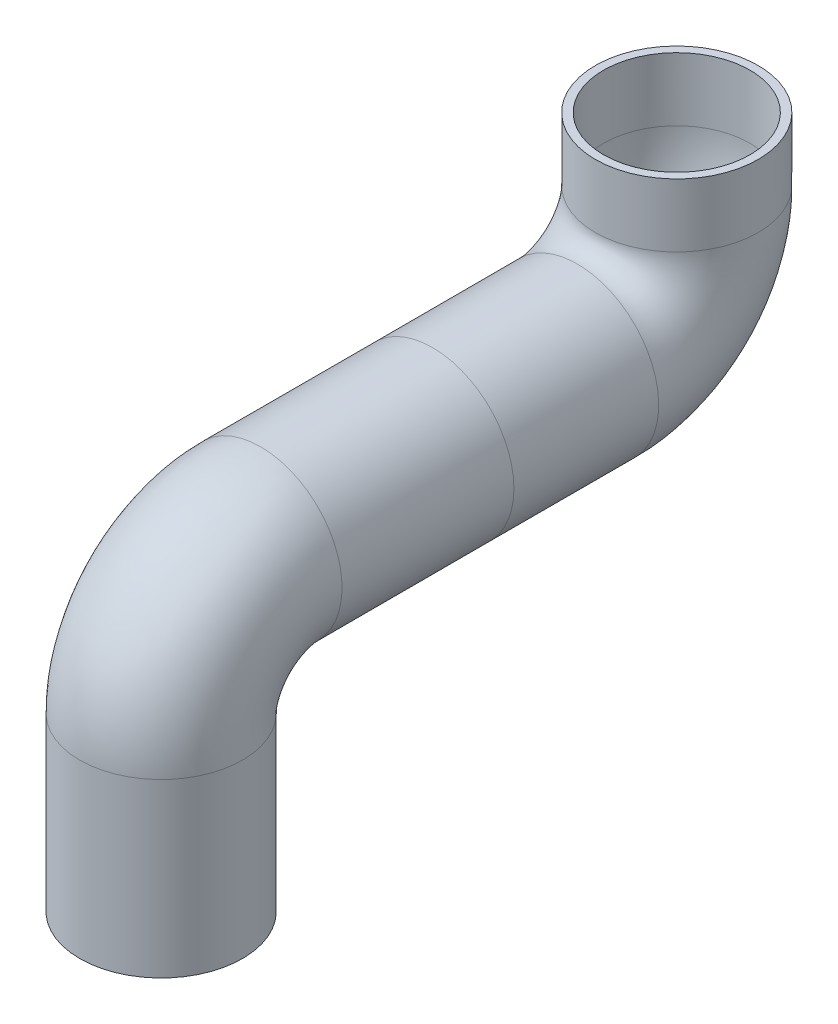
ISO-10303-21;
HEADER;
FILE_DESCRIPTION(('STEP AP214'),'2;1');
FILE_NAME('part.step','',(''),(''),'','','');
FILE_SCHEMA(('AUTOMOTIVE_DESIGN { 1 0 10303 214 1 1 1 1 }'));
ENDSEC;
DATA;
#1=APPLICATION_CONTEXT('core data for automotive mechanical design processes');
#2=APPLICATION_PROTOCOL_DEFINITION('international standard','automotive_design',2000,#1);
#3=PRODUCT_CONTEXT('',#1,'mechanical');
#4=PRODUCT('Part','Part','',(#3));
#5=PRODUCT_RELATED_PRODUCT_CATEGORY('part','',(#4));
#6=PRODUCT_DEFINITION_FORMATION('','',#4);
#7=PRODUCT_DEFINITION_CONTEXT('part definition',#1,'design');
#8=PRODUCT_DEFINITION('design','',#6,#7);
#9=PRODUCT_DEFINITION_SHAPE('','',#8);
#10=(LENGTH_UNIT() NAMED_UNIT(*) SI_UNIT(.MILLI.,.METRE.));
#11=(NAMED_UNIT(*) PLANE_ANGLE_UNIT() SI_UNIT($,.RADIAN.));
#12=(NAMED_UNIT(*) SI_UNIT($,.STERADIAN.) SOLID_ANGLE_UNIT());
#13=UNCERTAINTY_MEASURE_WITH_UNIT(LENGTH_MEASURE(1.E-05),#10,'distance_accuracy_value','');
#14=(GEOMETRIC_REPRESENTATION_CONTEXT(3) GLOBAL_UNCERTAINTY_ASSIGNED_CONTEXT((#13)) GLOBAL_UNIT_ASSIGNED_CONTEXT((#10,
#11,#12)) REPRESENTATION_CONTEXT('',''));
#15=CARTESIAN_POINT('',(0.,0.,0.));
#16=DIRECTION('',(0.,0.,1.));
#17=DIRECTION('',(1.,0.,0.));
#18=AXIS2_PLACEMENT_3D('',#15,#16,#17);
#19=CARTESIAN_POINT('',(0.,0.,0.));
#20=DIRECTION('',(0.,1.,0.));
#21=DIRECTION('',(0.,0.,1.));
#22=AXIS2_PLACEMENT_3D('',#19,#20,#21);
#23=CYLINDRICAL_SURFACE('',#22,150.);
#24=CARTESIAN_POINT('',(0.,316.669999999999,0.));
#25=DIRECTION('',(0.,1.,0.));
#26=DIRECTION('',(0.,0.,1.));
#27=AXIS2_PLACEMENT_3D('',#24,#25,#26);
#28=CIRCLE('',#27,150.);
#29=CARTESIAN_POINT('',(0.,316.669999999998,150.));
#30=VERTEX_POINT('',#29);
#31=EDGE_CURVE('E80',#30,#30,#28,.T.);
#32=ORIENTED_EDGE('',*,*,#31,.F.);
#33=EDGE_LOOP('',(#32));
#34=FACE_BOUND('',#33,.T.);
#35=CARTESIAN_POINT('',(0.,0.,0.));
#36=DIRECTION('',(0.,1.,0.));
#37=DIRECTION('',(0.,0.,1.));
#38=AXIS2_PLACEMENT_3D('',#35,#36,#37);
#39=CIRCLE('',#38,150.);
#40=CARTESIAN_POINT('',(0.,0.,150.));
#41=VERTEX_POINT('',#40);
#42=EDGE_CURVE('E47',#41,#41,#39,.T.);
#43=ORIENTED_EDGE('',*,*,#42,.T.);
#44=EDGE_LOOP('',(#43));
#45=FACE_BOUND('',#44,.T.);
#46=ADVANCED_FACE('F32',(#34,#45),#23,.T.);
#47=CARTESIAN_POINT('',(0.,316.67,-183.33));
#48=DIRECTION('',(-1.,0.,0.));
#49=DIRECTION('',(0.,0.,1.));
#50=AXIS2_PLACEMENT_3D('',#47,#48,#49);
#51=TOROIDAL_SURFACE('',#50,183.33,150.);
#52=CARTESIAN_POINT('',(0.,500.,-183.330000000001));
#53=DIRECTION('',(0.,0.,-1.));
#54=DIRECTION('',(0.,1.,0.));
#55=AXIS2_PLACEMENT_3D('',#52,#53,#54);
#56=CIRCLE('',#55,150.);
#57=CARTESIAN_POINT('',(0.,650.,-183.330000000002));
#58=VERTEX_POINT('',#57);
#59=EDGE_CURVE('E83',#58,#58,#56,.T.);
#60=CARTESIAN_POINT('',(0.,316.67,-183.33));
#61=DIRECTION('',(-1.,0.,0.));
#62=DIRECTION('',(0.,0.,1.));
#63=AXIS2_PLACEMENT_3D('',#60,#61,#62);
#64=CIRCLE('',#63,333.33);
#65=EDGE_CURVE('',#30,#58,#64,.T.);
#66=ORIENTED_EDGE('',*,*,#31,.T.);
#67=ORIENTED_EDGE('',*,*,#59,.F.);
#68=ORIENTED_EDGE('',*,*,#65,.T.);
#69=ORIENTED_EDGE('',*,*,#65,.F.);
#70=EDGE_LOOP('',(#66,#68,#67,#69));
#71=FACE_BOUND('',#70,.T.);
#72=ADVANCED_FACE('F110',(#71),#51,.T.);
#73=CARTESIAN_POINT('',(0.,500.,-183.330000000001));
#74=DIRECTION('',(0.,0.,-1.));
#75=DIRECTION('',(-1.,0.,0.));
#76=AXIS2_PLACEMENT_3D('',#73,#74,#75);
#77=CYLINDRICAL_SURFACE('',#76,150.);
#78=CARTESIAN_POINT('',(0.,500.,-500.));
#79=DIRECTION('',(0.,0.,-1.));
#80=DIRECTION('',(0.,1.,0.));
#81=AXIS2_PLACEMENT_3D('',#78,#79,#80);
#82=CIRCLE('',#81,150.);
#83=CARTESIAN_POINT('',(0.,650.,-500.));
#84=VERTEX_POINT('',#83);
#85=EDGE_CURVE('E86',#84,#84,#82,.T.);
#86=ORIENTED_EDGE('',*,*,#85,.F.);
#87=EDGE_LOOP('',(#86));
#88=FACE_BOUND('',#87,.T.);
#89=ORIENTED_EDGE('',*,*,#59,.T.);
#90=EDGE_LOOP('',(#89));
#91=FACE_BOUND('',#90,.T.);
#92=ADVANCED_FACE('F104',(#88,#91),#77,.T.);
#93=CARTESIAN_POINT('',(0.,500.,-500.));
#94=DIRECTION('',(0.,0.,-1.));
#95=DIRECTION('',(-1.,0.,0.));
#96=AXIS2_PLACEMENT_3D('',#93,#94,#95);
#97=CYLINDRICAL_SURFACE('',#96,150.);
#98=CARTESIAN_POINT('',(0.,500.,-766.669999999999));
#99=DIRECTION('',(0.,0.,-1.));
#100=DIRECTION('',(0.,1.,0.));
#101=AXIS2_PLACEMENT_3D('',#98,#99,#100);
#102=CIRCLE('',#101,150.);
#103=CARTESIAN_POINT('',(0.,350.,-766.669999999998));
#104=VERTEX_POINT('',#103);
#105=EDGE_CURVE('E88',#104,#104,#102,.T.);
#106=ORIENTED_EDGE('',*,*,#105,.F.);
#107=EDGE_LOOP('',(#106));
#108=FACE_BOUND('',#107,.T.);
#109=ORIENTED_EDGE('',*,*,#85,.T.);
#110=EDGE_LOOP('',(#109));
#111=FACE_BOUND('',#110,.T.);
#112=ADVANCED_FACE('F98',(#108,#111),#97,.T.);
#113=CARTESIAN_POINT('',(0.,683.33,-766.67));
#114=DIRECTION('',(1.,0.,0.));
#115=DIRECTION('',(0.,0.,-1.));
#116=AXIS2_PLACEMENT_3D('',#113,#114,#115);
#117=TOROIDAL_SURFACE('',#116,183.33,150.);
#118=CARTESIAN_POINT('',(0.,683.33,-950.));
#119=DIRECTION('',(0.,1.,0.));
#120=DIRECTION('',(0.,0.,1.));
#121=AXIS2_PLACEMENT_3D('',#118,#119,#120);
#122=CIRCLE('',#121,150.);
#123=CARTESIAN_POINT('',(0.,683.33,-1100.));
#124=VERTEX_POINT('',#123);
#125=EDGE_CURVE('E36',#124,#124,#122,.T.);
#126=CARTESIAN_POINT('',(0.,683.33,-766.67));
#127=DIRECTION('',(1.,0.,0.));
#128=DIRECTION('',(0.,0.,-1.));
#129=AXIS2_PLACEMENT_3D('',#126,#127,#128);
#130=CIRCLE('',#129,333.33);
#131=EDGE_CURVE('',#104,#124,#130,.T.);
#132=ORIENTED_EDGE('',*,*,#105,.T.);
#133=ORIENTED_EDGE('',*,*,#125,.F.);
#134=ORIENTED_EDGE('',*,*,#131,.T.);
#135=ORIENTED_EDGE('',*,*,#131,.F.);
#136=EDGE_LOOP('',(#132,#134,#133,#135));
#137=FACE_BOUND('',#136,.T.);
#138=ADVANCED_FACE('F96',(#137),#117,.T.);
#139=CARTESIAN_POINT('',(0.,683.33,-950.));
#140=DIRECTION('',(0.,1.,0.));
#141=DIRECTION('',(0.,0.,1.));
#142=AXIS2_PLACEMENT_3D('',#139,#140,#141);
#143=CYLINDRICAL_SURFACE('',#142,150.);
#144=CARTESIAN_POINT('',(0.,800.,-950.));
#145=DIRECTION('',(0.,1.,0.));
#146=DIRECTION('',(0.,0.,1.));
#147=AXIS2_PLACEMENT_3D('',#144,#145,#146);
#148=CIRCLE('',#147,150.);
#149=CARTESIAN_POINT('',(0.,800.,-800.));
#150=VERTEX_POINT('',#149);
#151=EDGE_CURVE('E52',#150,#150,#148,.T.);
#152=ORIENTED_EDGE('',*,*,#151,.F.);
#153=EDGE_LOOP('',(#152));
#154=FACE_BOUND('',#153,.T.);
#155=ORIENTED_EDGE('',*,*,#125,.T.);
#156=EDGE_LOOP('',(#155));
#157=FACE_BOUND('',#156,.T.);
#158=ADVANCED_FACE('F34',(#154,#157),#143,.T.);
#159=CARTESIAN_POINT('',(0.,0.,0.));
#160=DIRECTION('',(0.,1.,0.));
#161=DIRECTION('',(0.,0.,1.));
#162=AXIS2_PLACEMENT_3D('',#159,#160,#161);
#163=PLANE('',#162);
#164=CARTESIAN_POINT('',(0.,0.,0.));
#165=DIRECTION('',(0.,1.,0.));
#166=DIRECTION('',(0.,0.,1.));
#167=AXIS2_PLACEMENT_3D('',#164,#165,#166);
#168=CIRCLE('',#167,135.);
#169=CARTESIAN_POINT('',(0.,0.,135.));
#170=VERTEX_POINT('',#169);
#171=EDGE_CURVE('E78',#170,#170,#168,.F.);
#172=ORIENTED_EDGE('',*,*,#171,.F.);
#173=EDGE_LOOP('',(#172));
#174=FACE_BOUND('',#173,.T.);
#175=ORIENTED_EDGE('',*,*,#42,.F.);
#176=EDGE_LOOP('',(#175));
#177=FACE_BOUND('',#176,.T.);
#178=ADVANCED_FACE('F103',(#174,#177),#163,.F.);
#179=CARTESIAN_POINT('',(0.,800.,-950.));
#180=DIRECTION('',(0.,1.,0.));
#181=DIRECTION('',(0.,0.,1.));
#182=AXIS2_PLACEMENT_3D('',#179,#180,#181);
#183=PLANE('',#182);
#184=CARTESIAN_POINT('',(0.,800.,-950.));
#185=DIRECTION('',(0.,1.,0.));
#186=DIRECTION('',(0.,0.,1.));
#187=AXIS2_PLACEMENT_3D('',#184,#185,#186);
#188=CIRCLE('',#187,135.);
#189=CARTESIAN_POINT('',(0.,800.,-815.));
#190=VERTEX_POINT('',#189);
#191=EDGE_CURVE('E11',#190,#190,#188,.F.);
#192=ORIENTED_EDGE('',*,*,#191,.T.);
#193=EDGE_LOOP('',(#192));
#194=FACE_BOUND('',#193,.T.);
#195=ORIENTED_EDGE('',*,*,#151,.T.);
#196=EDGE_LOOP('',(#195));
#197=FACE_BOUND('',#196,.T.);
#198=ADVANCED_FACE('F59',(#194,#197),#183,.T.);
#199=CARTESIAN_POINT('',(0.,0.,0.));
#200=DIRECTION('',(0.,1.,0.));
#201=DIRECTION('',(0.,0.,1.));
#202=AXIS2_PLACEMENT_3D('',#199,#200,#201);
#203=CYLINDRICAL_SURFACE('',#202,135.);
#204=CARTESIAN_POINT('',(0.,316.669999999999,0.));
#205=DIRECTION('',(0.,1.,0.));
#206=DIRECTION('',(0.,0.,1.));
#207=AXIS2_PLACEMENT_3D('',#204,#205,#206);
#208=CIRCLE('',#207,135.);
#209=CARTESIAN_POINT('',(0.,316.669999999998,135.));
#210=VERTEX_POINT('',#209);
#211=EDGE_CURVE('E145',#210,#210,#208,.F.);
#212=ORIENTED_EDGE('',*,*,#211,.F.);
#213=EDGE_LOOP('',(#212));
#214=FACE_BOUND('',#213,.T.);
#215=ORIENTED_EDGE('',*,*,#171,.T.);
#216=EDGE_LOOP('',(#215));
#217=FACE_BOUND('',#216,.T.);
#218=ADVANCED_FACE('F122',(#214,#217),#203,.F.);
#219=CARTESIAN_POINT('',(0.,316.67,-183.33));
#220=DIRECTION('',(-1.,0.,0.));
#221=DIRECTION('',(0.,0.,1.));
#222=AXIS2_PLACEMENT_3D('',#219,#220,#221);
#223=TOROIDAL_SURFACE('',#222,183.33,135.);
#224=CARTESIAN_POINT('',(0.,500.,-183.330000000001));
#225=DIRECTION('',(0.,0.,-1.));
#226=DIRECTION('',(0.,1.,0.));
#227=AXIS2_PLACEMENT_3D('',#224,#225,#226);
#228=CIRCLE('',#227,135.);
#229=CARTESIAN_POINT('',(0.,635.,-183.330000000002));
#230=VERTEX_POINT('',#229);
#231=EDGE_CURVE('E148',#230,#230,#228,.F.);
#232=CARTESIAN_POINT('',(0.,316.67,-183.33));
#233=DIRECTION('',(-1.,0.,0.));
#234=DIRECTION('',(0.,0.,1.));
#235=AXIS2_PLACEMENT_3D('',#232,#233,#234);
#236=CIRCLE('',#235,318.33);
#237=EDGE_CURVE('',#210,#230,#236,.T.);
#238=ORIENTED_EDGE('',*,*,#211,.T.);
#239=ORIENTED_EDGE('',*,*,#231,.F.);
#240=ORIENTED_EDGE('',*,*,#237,.T.);
#241=ORIENTED_EDGE('',*,*,#237,.F.);
#242=EDGE_LOOP('',(#238,#240,#239,#241));
#243=FACE_BOUND('',#242,.T.);
#244=ADVANCED_FACE('F133',(#243),#223,.F.);
#245=CARTESIAN_POINT('',(0.,500.,-183.330000000001));
#246=DIRECTION('',(0.,0.,-1.));
#247=DIRECTION('',(-1.,0.,0.));
#248=AXIS2_PLACEMENT_3D('',#245,#246,#247);
#249=CYLINDRICAL_SURFACE('',#248,135.);
#250=CARTESIAN_POINT('',(0.,500.,-500.));
#251=DIRECTION('',(0.,0.,-1.));
#252=DIRECTION('',(0.,1.,0.));
#253=AXIS2_PLACEMENT_3D('',#250,#251,#252);
#254=CIRCLE('',#253,135.);
#255=CARTESIAN_POINT('',(0.,635.,-500.));
#256=VERTEX_POINT('',#255);
#257=EDGE_CURVE('E73',#256,#256,#254,.F.);
#258=ORIENTED_EDGE('',*,*,#257,.F.);
#259=EDGE_LOOP('',(#258));
#260=FACE_BOUND('',#259,.T.);
#261=ORIENTED_EDGE('',*,*,#231,.T.);
#262=EDGE_LOOP('',(#261));
#263=FACE_BOUND('',#262,.T.);
#264=ADVANCED_FACE('F129',(#260,#263),#249,.F.);
#265=CARTESIAN_POINT('',(0.,500.,-500.));
#266=DIRECTION('',(0.,0.,-1.));
#267=DIRECTION('',(-1.,0.,0.));
#268=AXIS2_PLACEMENT_3D('',#265,#266,#267);
#269=CYLINDRICAL_SURFACE('',#268,135.);
#270=CARTESIAN_POINT('',(0.,500.,-766.669999999999));
#271=DIRECTION('',(0.,0.,-1.));
#272=DIRECTION('',(0.,1.,0.));
#273=AXIS2_PLACEMENT_3D('',#270,#271,#272);
#274=CIRCLE('',#273,135.);
#275=CARTESIAN_POINT('',(0.,365.,-766.669999999998));
#276=VERTEX_POINT('',#275);
#277=EDGE_CURVE('E70',#276,#276,#274,.F.);
#278=ORIENTED_EDGE('',*,*,#277,.F.);
#279=EDGE_LOOP('',(#278));
#280=FACE_BOUND('',#279,.T.);
#281=ORIENTED_EDGE('',*,*,#257,.T.);
#282=EDGE_LOOP('',(#281));
#283=FACE_BOUND('',#282,.T.);
#284=ADVANCED_FACE('F126',(#280,#283),#269,.F.);
#285=CARTESIAN_POINT('',(0.,683.33,-766.67));
#286=DIRECTION('',(1.,0.,0.));
#287=DIRECTION('',(0.,0.,-1.));
#288=AXIS2_PLACEMENT_3D('',#285,#286,#287);
#289=TOROIDAL_SURFACE('',#288,183.33,135.);
#290=CARTESIAN_POINT('',(0.,683.33,-950.));
#291=DIRECTION('',(0.,1.,0.));
#292=DIRECTION('',(0.,0.,1.));
#293=AXIS2_PLACEMENT_3D('',#290,#291,#292);
#294=CIRCLE('',#293,135.);
#295=CARTESIAN_POINT('',(0.,683.33,-1085.));
#296=VERTEX_POINT('',#295);
#297=EDGE_CURVE('E41',#296,#296,#294,.F.);
#298=CARTESIAN_POINT('',(0.,683.33,-766.67));
#299=DIRECTION('',(1.,0.,0.));
#300=DIRECTION('',(0.,0.,-1.));
#301=AXIS2_PLACEMENT_3D('',#298,#299,#300);
#302=CIRCLE('',#301,318.33);
#303=EDGE_CURVE('',#276,#296,#302,.T.);
#304=ORIENTED_EDGE('',*,*,#277,.T.);
#305=ORIENTED_EDGE('',*,*,#297,.F.);
#306=ORIENTED_EDGE('',*,*,#303,.T.);
#307=ORIENTED_EDGE('',*,*,#303,.F.);
#308=EDGE_LOOP('',(#304,#306,#305,#307));
#309=FACE_BOUND('',#308,.T.);
#310=ADVANCED_FACE('F65',(#309),#289,.F.);
#311=CARTESIAN_POINT('',(0.,683.33,-950.));
#312=DIRECTION('',(0.,1.,0.));
#313=DIRECTION('',(0.,0.,1.));
#314=AXIS2_PLACEMENT_3D('',#311,#312,#313);
#315=CYLINDRICAL_SURFACE('',#314,135.);
#316=ORIENTED_EDGE('',*,*,#191,.F.);
#317=EDGE_LOOP('',(#316));
#318=FACE_BOUND('',#317,.T.);
#319=ORIENTED_EDGE('',*,*,#297,.T.);
#320=EDGE_LOOP('',(#319));
#321=FACE_BOUND('',#320,.T.);
#322=ADVANCED_FACE('F62',(#318,#321),#315,.F.);
#323=CLOSED_SHELL('',(#46,#72,#92,#112,#138,#158,#178,#198,#218,#244,#264,#284,#310,#322));
#324=MANIFOLD_SOLID_BREP('B2',#323);
#325=ADVANCED_BREP_SHAPE_REPRESENTATION('',(#18,#324),#14);
#326=SHAPE_DEFINITION_REPRESENTATION(#9,#325);
ENDSEC;
END-ISO-10303-21;
